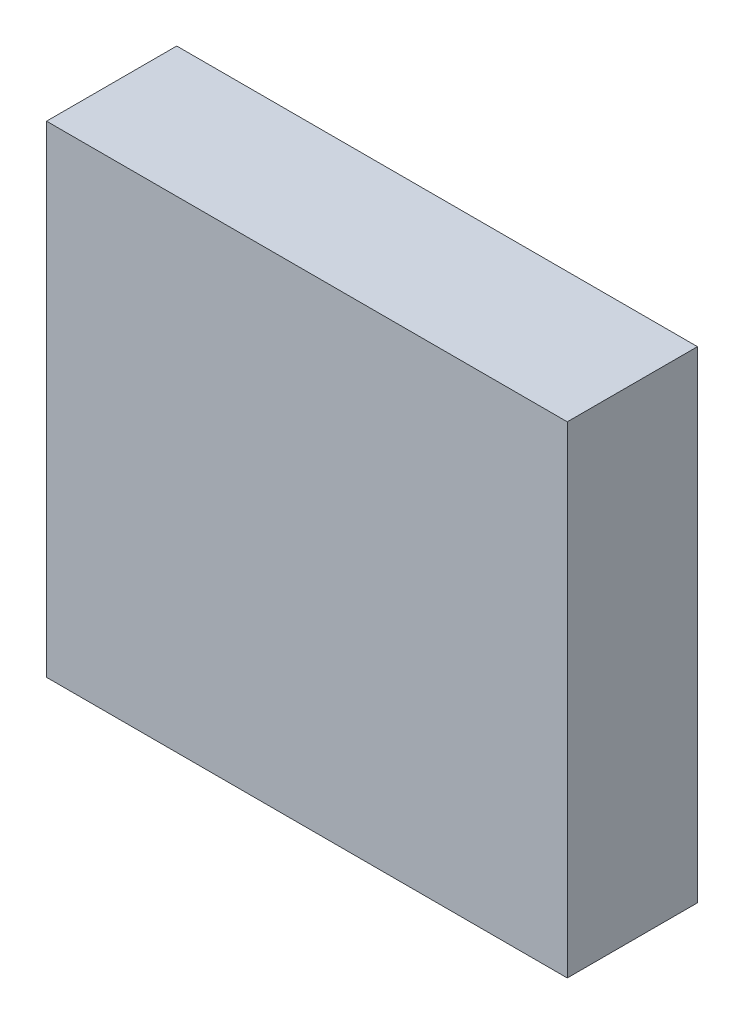
ISO-10303-21;
HEADER;
FILE_DESCRIPTION(('STEP AP214'),'2;1');
FILE_NAME('part.step','',(''),(''),'','','');
FILE_SCHEMA(('AUTOMOTIVE_DESIGN { 1 0 10303 214 1 1 1 1 }'));
ENDSEC;
DATA;
#1=APPLICATION_CONTEXT('core data for automotive mechanical design processes');
#2=APPLICATION_PROTOCOL_DEFINITION('international standard','automotive_design',2000,#1);
#3=PRODUCT_CONTEXT('',#1,'mechanical');
#4=PRODUCT('Part','Part','',(#3));
#5=PRODUCT_RELATED_PRODUCT_CATEGORY('part','',(#4));
#6=PRODUCT_DEFINITION_FORMATION('','',#4);
#7=PRODUCT_DEFINITION_CONTEXT('part definition',#1,'design');
#8=PRODUCT_DEFINITION('design','',#6,#7);
#9=PRODUCT_DEFINITION_SHAPE('','',#8);
#10=(LENGTH_UNIT() NAMED_UNIT(*) SI_UNIT(.MILLI.,.METRE.));
#11=(NAMED_UNIT(*) PLANE_ANGLE_UNIT() SI_UNIT($,.RADIAN.));
#12=(NAMED_UNIT(*) SI_UNIT($,.STERADIAN.) SOLID_ANGLE_UNIT());
#13=UNCERTAINTY_MEASURE_WITH_UNIT(LENGTH_MEASURE(1.E-05),#10,'distance_accuracy_value','');
#14=(GEOMETRIC_REPRESENTATION_CONTEXT(3) GLOBAL_UNCERTAINTY_ASSIGNED_CONTEXT((#13)) GLOBAL_UNIT_ASSIGNED_CONTEXT((#10,
#11,#12)) REPRESENTATION_CONTEXT('',''));
#15=CARTESIAN_POINT('',(0.,0.,0.));
#16=DIRECTION('',(0.,0.,1.));
#17=DIRECTION('',(1.,0.,0.));
#18=AXIS2_PLACEMENT_3D('',#15,#16,#17);
#19=CARTESIAN_POINT('',(0.,0.,-10.));
#20=DIRECTION('',(-1.,0.,0.));
#21=DIRECTION('',(0.,0.,1.));
#22=AXIS2_PLACEMENT_3D('',#19,#20,#21);
#23=PLANE('',#22);
#24=DIRECTION('',(0.,-1.,0.));
#25=VECTOR('',#24,1.);
#26=CARTESIAN_POINT('',(0.,0.,0.));
#27=LINE('',#26,#25);
#28=CARTESIAN_POINT('',(0.,37.,0.));
#29=VERTEX_POINT('',#28);
#30=CARTESIAN_POINT('',(0.,0.,0.));
#31=VERTEX_POINT('',#30);
#32=EDGE_CURVE('E107',#29,#31,#27,.T.);
#33=ORIENTED_EDGE('',*,*,#32,.F.);
#34=DIRECTION('',(0.,0.,1.));
#35=VECTOR('',#34,1.);
#36=CARTESIAN_POINT('',(0.,37.,-10.));
#37=LINE('',#36,#35);
#38=CARTESIAN_POINT('',(0.,37.,-10.));
#39=VERTEX_POINT('',#38);
#40=EDGE_CURVE('E11',#39,#29,#37,.T.);
#41=ORIENTED_EDGE('',*,*,#40,.F.);
#42=DIRECTION('',(0.,-1.,0.));
#43=VECTOR('',#42,1.);
#44=CARTESIAN_POINT('',(0.,0.,-10.));
#45=LINE('',#44,#43);
#46=CARTESIAN_POINT('',(0.,0.,-10.));
#47=VERTEX_POINT('',#46);
#48=EDGE_CURVE('E102',#39,#47,#45,.T.);
#49=ORIENTED_EDGE('',*,*,#48,.T.);
#50=DIRECTION('',(0.,0.,1.));
#51=VECTOR('',#50,1.);
#52=CARTESIAN_POINT('',(0.,0.,-10.));
#53=LINE('',#52,#51);
#54=EDGE_CURVE('E46',#47,#31,#53,.T.);
#55=ORIENTED_EDGE('',*,*,#54,.T.);
#56=EDGE_LOOP('',(#33,#41,#49,#55));
#57=FACE_BOUND('',#56,.T.);
#58=ADVANCED_FACE('F43',(#57),#23,.T.);
#59=CARTESIAN_POINT('',(0.,37.,-10.));
#60=DIRECTION('',(0.,1.,0.));
#61=DIRECTION('',(0.,0.,1.));
#62=AXIS2_PLACEMENT_3D('',#59,#60,#61);
#63=PLANE('',#62);
#64=DIRECTION('',(-1.,0.,0.));
#65=VECTOR('',#64,1.);
#66=CARTESIAN_POINT('',(0.,37.,0.));
#67=LINE('',#66,#65);
#68=CARTESIAN_POINT('',(40.,37.,0.));
#69=VERTEX_POINT('',#68);
#70=EDGE_CURVE('E104',#69,#29,#67,.T.);
#71=ORIENTED_EDGE('',*,*,#70,.F.);
#72=DIRECTION('',(0.,0.,1.));
#73=VECTOR('',#72,1.);
#74=CARTESIAN_POINT('',(40.,37.,-10.));
#75=LINE('',#74,#73);
#76=CARTESIAN_POINT('',(40.,37.,-10.));
#77=VERTEX_POINT('',#76);
#78=EDGE_CURVE('E55',#77,#69,#75,.T.);
#79=ORIENTED_EDGE('',*,*,#78,.F.);
#80=DIRECTION('',(-1.,0.,0.));
#81=VECTOR('',#80,1.);
#82=CARTESIAN_POINT('',(0.,37.,-10.));
#83=LINE('',#82,#81);
#84=EDGE_CURVE('E97',#77,#39,#83,.T.);
#85=ORIENTED_EDGE('',*,*,#84,.T.);
#86=ORIENTED_EDGE('',*,*,#40,.T.);
#87=EDGE_LOOP('',(#71,#79,#85,#86));
#88=FACE_BOUND('',#87,.T.);
#89=ADVANCED_FACE('F117',(#88),#63,.T.);
#90=CARTESIAN_POINT('',(40.,0.,-10.));
#91=DIRECTION('',(1.,0.,0.));
#92=DIRECTION('',(0.,0.,-1.));
#93=AXIS2_PLACEMENT_3D('',#90,#91,#92);
#94=PLANE('',#93);
#95=DIRECTION('',(0.,1.,0.));
#96=VECTOR('',#95,1.);
#97=CARTESIAN_POINT('',(40.,0.,0.));
#98=LINE('',#97,#96);
#99=CARTESIAN_POINT('',(40.,0.,0.));
#100=VERTEX_POINT('',#99);
#101=EDGE_CURVE('E93',#100,#69,#98,.T.);
#102=ORIENTED_EDGE('',*,*,#101,.F.);
#103=DIRECTION('',(0.,0.,1.));
#104=VECTOR('',#103,1.);
#105=CARTESIAN_POINT('',(40.,0.,-10.));
#106=LINE('',#105,#104);
#107=CARTESIAN_POINT('',(40.,0.,-10.));
#108=VERTEX_POINT('',#107);
#109=EDGE_CURVE('E88',#108,#100,#106,.T.);
#110=ORIENTED_EDGE('',*,*,#109,.F.);
#111=DIRECTION('',(0.,1.,0.));
#112=VECTOR('',#111,1.);
#113=CARTESIAN_POINT('',(40.,0.,-10.));
#114=LINE('',#113,#112);
#115=EDGE_CURVE('E91',#108,#77,#114,.T.);
#116=ORIENTED_EDGE('',*,*,#115,.T.);
#117=ORIENTED_EDGE('',*,*,#78,.T.);
#118=EDGE_LOOP('',(#102,#110,#116,#117));
#119=FACE_BOUND('',#118,.T.);
#120=ADVANCED_FACE('F89',(#119),#94,.T.);
#121=CARTESIAN_POINT('',(0.,0.,-10.));
#122=DIRECTION('',(0.,-1.,0.));
#123=DIRECTION('',(0.,0.,-1.));
#124=AXIS2_PLACEMENT_3D('',#121,#122,#123);
#125=PLANE('',#124);
#126=DIRECTION('',(1.,0.,0.));
#127=VECTOR('',#126,1.);
#128=CARTESIAN_POINT('',(0.,0.,0.));
#129=LINE('',#128,#127);
#130=EDGE_CURVE('E110',#31,#100,#129,.T.);
#131=ORIENTED_EDGE('',*,*,#130,.F.);
#132=ORIENTED_EDGE('',*,*,#54,.F.);
#133=DIRECTION('',(1.,0.,0.));
#134=VECTOR('',#133,1.);
#135=CARTESIAN_POINT('',(0.,0.,-10.));
#136=LINE('',#135,#134);
#137=EDGE_CURVE('E100',#47,#108,#136,.T.);
#138=ORIENTED_EDGE('',*,*,#137,.T.);
#139=ORIENTED_EDGE('',*,*,#109,.T.);
#140=EDGE_LOOP('',(#131,#132,#138,#139));
#141=FACE_BOUND('',#140,.T.);
#142=ADVANCED_FACE('F99',(#141),#125,.T.);
#143=CARTESIAN_POINT('',(0.,0.,-10.));
#144=DIRECTION('',(0.,0.,-1.));
#145=DIRECTION('',(-1.,0.,0.));
#146=AXIS2_PLACEMENT_3D('',#143,#144,#145);
#147=PLANE('',#146);
#148=ORIENTED_EDGE('',*,*,#48,.F.);
#149=ORIENTED_EDGE('',*,*,#84,.F.);
#150=ORIENTED_EDGE('',*,*,#115,.F.);
#151=ORIENTED_EDGE('',*,*,#137,.F.);
#152=EDGE_LOOP('',(#148,#149,#150,#151));
#153=FACE_BOUND('',#152,.T.);
#154=ADVANCED_FACE('F96',(#153),#147,.T.);
#155=CARTESIAN_POINT('',(0.,0.,0.));
#156=DIRECTION('',(0.,0.,-1.));
#157=DIRECTION('',(-1.,0.,0.));
#158=AXIS2_PLACEMENT_3D('',#155,#156,#157);
#159=PLANE('',#158);
#160=ORIENTED_EDGE('',*,*,#32,.T.);
#161=ORIENTED_EDGE('',*,*,#130,.T.);
#162=ORIENTED_EDGE('',*,*,#101,.T.);
#163=ORIENTED_EDGE('',*,*,#70,.T.);
#164=EDGE_LOOP('',(#160,#161,#162,#163));
#165=FACE_BOUND('',#164,.T.);
#166=ADVANCED_FACE('F116',(#165),#159,.F.);
#167=CLOSED_SHELL('',(#58,#89,#120,#142,#154,#166));
#168=MANIFOLD_SOLID_BREP('B2',#167);
#169=ADVANCED_BREP_SHAPE_REPRESENTATION('',(#18,#168),#14);
#170=SHAPE_DEFINITION_REPRESENTATION(#9,#169);
ENDSEC;
END-ISO-10303-21;
